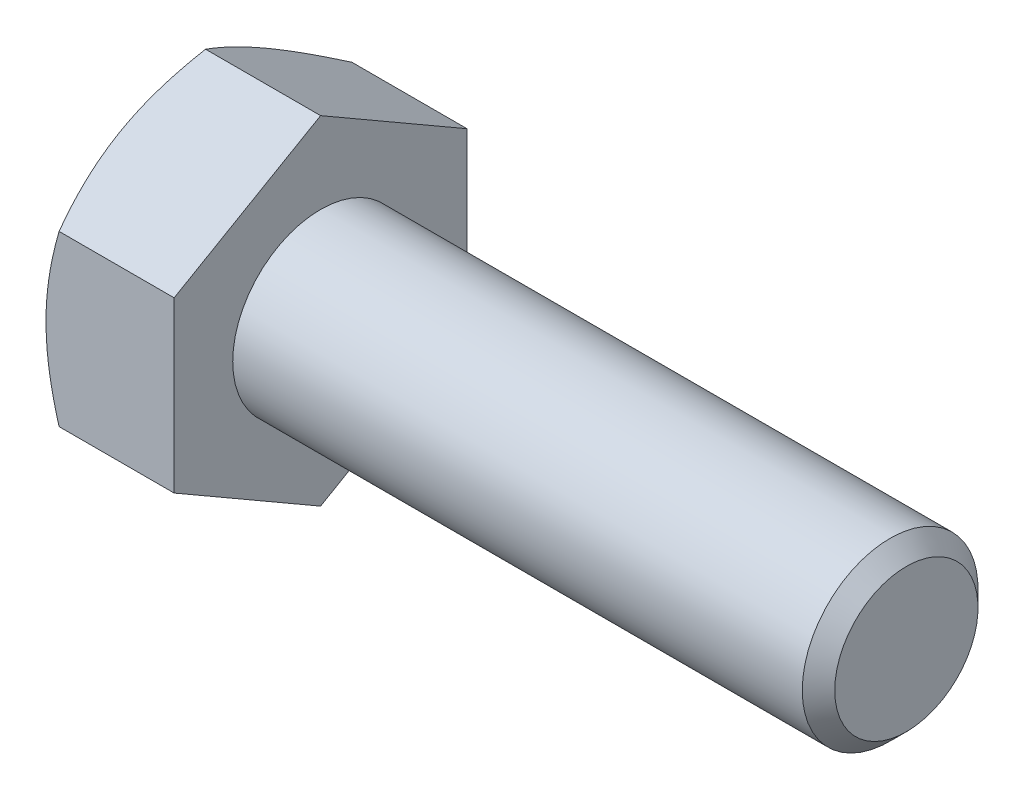
ISO-10303-21;
HEADER;
FILE_DESCRIPTION(('STEP AP214'),'2;1');
FILE_NAME('part.step','',(''),(''),'','','');
FILE_SCHEMA(('AUTOMOTIVE_DESIGN { 1 0 10303 214 1 1 1 1 }'));
ENDSEC;
DATA;
#1=APPLICATION_CONTEXT('core data for automotive mechanical design processes');
#2=APPLICATION_PROTOCOL_DEFINITION('international standard','automotive_design',2000,#1);
#3=PRODUCT_CONTEXT('',#1,'mechanical');
#4=PRODUCT('Part','Part','',(#3));
#5=PRODUCT_RELATED_PRODUCT_CATEGORY('part','',(#4));
#6=PRODUCT_DEFINITION_FORMATION('','',#4);
#7=PRODUCT_DEFINITION_CONTEXT('part definition',#1,'design');
#8=PRODUCT_DEFINITION('design','',#6,#7);
#9=PRODUCT_DEFINITION_SHAPE('','',#8);
#10=(LENGTH_UNIT() NAMED_UNIT(*) SI_UNIT(.MILLI.,.METRE.));
#11=(NAMED_UNIT(*) PLANE_ANGLE_UNIT() SI_UNIT($,.RADIAN.));
#12=(NAMED_UNIT(*) SI_UNIT($,.STERADIAN.) SOLID_ANGLE_UNIT());
#13=UNCERTAINTY_MEASURE_WITH_UNIT(LENGTH_MEASURE(1.E-05),#10,'distance_accuracy_value','');
#14=(GEOMETRIC_REPRESENTATION_CONTEXT(3) GLOBAL_UNCERTAINTY_ASSIGNED_CONTEXT((#13)) GLOBAL_UNIT_ASSIGNED_CONTEXT((#10,
#11,#12)) REPRESENTATION_CONTEXT('',''));
#15=CARTESIAN_POINT('',(0.,0.,0.));
#16=DIRECTION('',(0.,0.,1.));
#17=DIRECTION('',(1.,0.,0.));
#18=AXIS2_PLACEMENT_3D('',#15,#16,#17);
#19=CARTESIAN_POINT('',(4.375,2.88675134594812,-5.));
#20=DIRECTION('',(0.,-0.866025403784438,0.500000000000001));
#21=DIRECTION('',(0.,-0.500000000000001,-0.866025403784438));
#22=AXIS2_PLACEMENT_3D('',#19,#20,#21);
#23=PLANE('',#22);
#24=CARTESIAN_POINT('',(0.44664865605183,5.7736181619501,0.000200000000000224));
#25=CARTESIAN_POINT('',(0.373386567637636,5.64675433465071,-0.219534594525185));
#26=CARTESIAN_POINT('',(0.306751321918093,5.5188054379059,-0.44114858445958));
#27=CARTESIAN_POINT('',(0.190438991010812,5.26069210252318,-0.888213995453512));
#28=CARTESIAN_POINT('',(0.14080304991579,5.13052307794721,-1.11367335959077));
#29=CARTESIAN_POINT('',(0.0635510254186983,4.87177839004641,-1.56183230522351));
#30=CARTESIAN_POINT('',(0.0354203782834892,4.74324302208387,-1.78446209310419));
#31=CARTESIAN_POINT('',(0.0101949219536843,4.54998783160116,-2.11918990184664));
#32=CARTESIAN_POINT('',(0.00461345976948395,4.48552534905128,-2.23084219680506));
#33=CARTESIAN_POINT('',(-0.000797783248529861,4.35654081066911,-2.4542499706738));
#34=CARTESIAN_POINT('',(-0.000627741741796916,4.2920187567385,-2.56600544629031));
#35=CARTESIAN_POINT('',(0.00775363179203597,4.11524635305244,-2.87218423085064));
#36=CARTESIAN_POINT('',(0.0218297718972512,4.00305457769146,-3.06650608596721));
#37=CARTESIAN_POINT('',(0.0664652571094302,3.77941563226457,-3.4538601019977));
#38=CARTESIAN_POINT('',(0.097039860147507,3.66796924828418,-3.64689090137157));
#39=CARTESIAN_POINT('',(0.173468493621162,3.44387972423144,-4.03502534247485));
#40=CARTESIAN_POINT('',(0.219646378878678,3.3312648659868,-4.23007999864173));
#41=CARTESIAN_POINT('',(0.324451794491933,3.1077146415794,-4.61728034535877));
#42=CARTESIAN_POINT('',(0.383054703437373,2.99677641204846,-4.80943099540809));
#43=CARTESIAN_POINT('',(0.446648656051827,2.88663587589429,-5.0002));
#44=B_SPLINE_CURVE_WITH_KNOTS('',3,(#24,#25,#26,#27,#28,#29,#30,#31,#32,#33,#34,#35,#36,#37,#38,
#39,#40,#41,#42,#43),.UNSPECIFIED.,.F.,.F.,(4,2,2,2,2,2,2,2,2,4),(0.,0.792555841363091,
1.58701660053334,2.36181537487281,2.74884076077326,3.13585419177295,3.80962362599679,
4.48401723901189,5.17336882348929,5.86136694793726),.UNSPECIFIED.);
#45=CARTESIAN_POINT('',(0.446581987385204,5.77350269189626,0.));
#46=VERTEX_POINT('',#45);
#47=CARTESIAN_POINT('',(0.,4.33012701892219,-2.50000000000001));
#48=VERTEX_POINT('',#47);
#49=EDGE_CURVE('E52',#46,#48,#44,.T.);
#50=ORIENTED_EDGE('',*,*,#49,.F.);
#51=DIRECTION('',(-1.,0.,0.));
#52=VECTOR('',#51,1.);
#53=CARTESIAN_POINT('',(4.375,5.77350269189626,0.));
#54=LINE('',#53,#52);
#55=CARTESIAN_POINT('',(4.375,5.77350269189626,0.));
#56=VERTEX_POINT('',#55);
#57=EDGE_CURVE('E148',#56,#46,#54,.T.);
#58=ORIENTED_EDGE('',*,*,#57,.F.);
#59=DIRECTION('',(0.,0.500000000000001,0.866025403784438));
#60=VECTOR('',#59,1.);
#61=CARTESIAN_POINT('',(4.375,2.88675134594812,-5.));
#62=LINE('',#61,#60);
#63=CARTESIAN_POINT('',(4.375,2.88675134594812,-5.));
#64=VERTEX_POINT('',#63);
#65=EDGE_CURVE('E233',#64,#56,#62,.T.);
#66=ORIENTED_EDGE('',*,*,#65,.F.);
#67=DIRECTION('',(-1.,0.,0.));
#68=VECTOR('',#67,1.);
#69=CARTESIAN_POINT('',(4.375,2.88675134594812,-5.));
#70=LINE('',#69,#68);
#71=CARTESIAN_POINT('',(0.446581987385201,2.88675134594812,-5.));
#72=VERTEX_POINT('',#71);
#73=EDGE_CURVE('E136',#64,#72,#70,.T.);
#74=ORIENTED_EDGE('',*,*,#73,.T.);
#75=EDGE_CURVE('E130',#48,#72,#44,.T.);
#76=ORIENTED_EDGE('',*,*,#75,.F.);
#77=EDGE_LOOP('',(#50,#58,#66,#74,#76));
#78=FACE_BOUND('',#77,.T.);
#79=ADVANCED_FACE('F36',(#78),#23,.F.);
#80=CARTESIAN_POINT('',(4.375,5.77350269189626,0.));
#81=DIRECTION('',(0.,-0.866025403784438,-0.500000000000001));
#82=DIRECTION('',(0.,0.500000000000001,-0.866025403784438));
#83=AXIS2_PLACEMENT_3D('',#80,#81,#82);
#84=PLANE('',#83);
#85=CARTESIAN_POINT('',(0.446648656051828,2.88663587589429,5.0002));
#86=CARTESIAN_POINT('',(0.373386567637633,3.01349970319368,4.78046540547482));
#87=CARTESIAN_POINT('',(0.306751321918091,3.14144859993849,4.55885141554042));
#88=CARTESIAN_POINT('',(0.19043899101081,3.39956193532121,4.11178600454649));
#89=CARTESIAN_POINT('',(0.140803049915789,3.52973095989717,3.88632664040923));
#90=CARTESIAN_POINT('',(0.0635510254186981,3.78847564779797,3.43816769477649));
#91=CARTESIAN_POINT('',(0.0354203782834895,3.91701101576052,3.21553790689581));
#92=CARTESIAN_POINT('',(0.0101949219536846,4.11026620624322,2.88081009815336));
#93=CARTESIAN_POINT('',(0.00461345976948397,4.17472868879311,2.76915780319494));
#94=CARTESIAN_POINT('',(-0.000797783248529637,4.30371322717528,2.5457500293262));
#95=CARTESIAN_POINT('',(-0.000627741741796285,4.36823528110589,2.43399455370969));
#96=CARTESIAN_POINT('',(0.00775363179203729,4.54500768479194,2.12781576914936));
#97=CARTESIAN_POINT('',(0.0218297718972525,4.65719946015293,1.93349391403279));
#98=CARTESIAN_POINT('',(0.0664652571094319,4.88083840557981,1.5461398980023));
#99=CARTESIAN_POINT('',(0.0970398601475091,4.9922847895602,1.35310909862843));
#100=CARTESIAN_POINT('',(0.173468493621165,5.21637431361295,0.964974657525146));
#101=CARTESIAN_POINT('',(0.219646378878682,5.32898917185759,0.769920001358265));
#102=CARTESIAN_POINT('',(0.324451794491936,5.55253939626499,0.382719654641232));
#103=CARTESIAN_POINT('',(0.383054703437377,5.66347762579592,0.190569004591914));
#104=CARTESIAN_POINT('',(0.446648656051831,5.7736181619501,-0.000200000000000155));
#105=B_SPLINE_CURVE_WITH_KNOTS('',3,(#85,#86,#87,#88,#89,#90,#91,#92,#93,#94,#95,#96,#97,#98,
#99,#100,#101,#102,#103,#104),.UNSPECIFIED.,.F.,.F.,(4,2,2,2,2,2,2,2,2,4),(0.,0.79255584136309,
1.58701660053333,2.3618153748728,2.74884076077325,3.13585419177295,3.80962362599679,
4.48401723901189,5.17336882348929,5.86136694793726),.UNSPECIFIED.);
#106=CARTESIAN_POINT('',(0.446581987385201,2.88675134594813,5.));
#107=VERTEX_POINT('',#106);
#108=CARTESIAN_POINT('',(0.,4.33012701892219,2.5));
#109=VERTEX_POINT('',#108);
#110=EDGE_CURVE('E59',#107,#109,#105,.T.);
#111=ORIENTED_EDGE('',*,*,#110,.F.);
#112=DIRECTION('',(-1.,0.,0.));
#113=VECTOR('',#112,1.);
#114=CARTESIAN_POINT('',(4.375,2.88675134594813,5.));
#115=LINE('',#114,#113);
#116=CARTESIAN_POINT('',(4.375,2.88675134594813,5.));
#117=VERTEX_POINT('',#116);
#118=EDGE_CURVE('E146',#117,#107,#115,.T.);
#119=ORIENTED_EDGE('',*,*,#118,.F.);
#120=DIRECTION('',(0.,-0.500000000000001,0.866025403784438));
#121=VECTOR('',#120,1.);
#122=CARTESIAN_POINT('',(4.375,5.77350269189626,0.));
#123=LINE('',#122,#121);
#124=EDGE_CURVE('E231',#56,#117,#123,.T.);
#125=ORIENTED_EDGE('',*,*,#124,.F.);
#126=ORIENTED_EDGE('',*,*,#57,.T.);
#127=EDGE_CURVE('E163',#109,#46,#105,.T.);
#128=ORIENTED_EDGE('',*,*,#127,.F.);
#129=EDGE_LOOP('',(#111,#119,#125,#126,#128));
#130=FACE_BOUND('',#129,.T.);
#131=ADVANCED_FACE('F169',(#130),#84,.F.);
#132=CARTESIAN_POINT('',(4.375,2.88675134594813,5.));
#133=DIRECTION('',(0.,0.,-1.));
#134=DIRECTION('',(0.,1.,0.));
#135=AXIS2_PLACEMENT_3D('',#132,#133,#134);
#136=PLANE('',#135);
#137=CARTESIAN_POINT('',(2.47533544689295,-7.82661640313889,5.));
#138=CARTESIAN_POINT('',(2.36879683507773,-7.60758613024921,5.));
#139=CARTESIAN_POINT('',(2.26325911833056,-7.3880607136441,5.));
#140=CARTESIAN_POINT('',(2.0547470786595,-6.94775649535433,5.));
#141=CARTESIAN_POINT('',(1.95177314617002,-6.72697750897687,5.));
#142=CARTESIAN_POINT('',(1.74844778545274,-6.28280027125597,5.));
#143=CARTESIAN_POINT('',(1.64811306490868,-6.05939434592712,5.));
#144=CARTESIAN_POINT('',(1.45145486004312,-5.6108304383292,5.));
#145=CARTESIAN_POINT('',(1.35513119080617,-5.38567253739804,5.));
#146=CARTESIAN_POINT('',(1.1644503760596,-4.92576614780202,5.));
#147=CARTESIAN_POINT('',(1.07026351405995,-4.69094667859484,5.));
#148=CARTESIAN_POINT('',(0.888844387350834,-4.21858752735362,5.));
#149=CARTESIAN_POINT('',(0.801612892640656,-3.98104754746316,5.));
#150=CARTESIAN_POINT('',(0.636341071883237,-3.50329086404363,5.));
#151=CARTESIAN_POINT('',(0.558282765149708,-3.26308044250486,5.));
#152=CARTESIAN_POINT('',(0.413813856737663,-2.77921467819531,5.));
#153=CARTESIAN_POINT('',(0.347399663631973,-2.53556042275999,5.));
#154=CARTESIAN_POINT('',(0.22970745053505,-2.04600448312503,5.));
#155=CARTESIAN_POINT('',(0.178346573442477,-1.80012308686183,5.));
#156=CARTESIAN_POINT('',(0.0936230804935141,-1.30522837494365,5.));
#157=CARTESIAN_POINT('',(0.0602585789244913,-1.05621539022477,5.));
#158=CARTESIAN_POINT('',(0.0146229933804838,-0.559584253783063,5.));
#159=CARTESIAN_POINT('',(0.002074985065841,-0.31199219296767,5.));
#160=CARTESIAN_POINT('',(-0.00159747165030465,0.183375584056743,5.));
#161=CARTESIAN_POINT('',(0.00727849448086283,0.431151303726645,5.));
#162=CARTESIAN_POINT('',(0.0397265053205847,0.849622860758231,5.));
#163=CARTESIAN_POINT('',(0.0579847912618802,1.02075746544157,5.));
#164=CARTESIAN_POINT('',(0.103624049996723,1.3618139875752,5.));
#165=CARTESIAN_POINT('',(0.131006199082926,1.53173574577271,5.));
#166=CARTESIAN_POINT('',(0.225403333816324,2.03942834541587,5.));
#167=CARTESIAN_POINT('',(0.304653621104038,2.37495177168564,5.));
#168=CARTESIAN_POINT('',(0.442611792168642,2.87686006020152,5.));
#169=CARTESIAN_POINT('',(0.492453035928119,3.04583048582566,5.));
#170=CARTESIAN_POINT('',(0.597441969480143,3.38213061038659,5.));
#171=CARTESIAN_POINT('',(0.652589698776809,3.5494602970987,5.));
#172=CARTESIAN_POINT('',(0.7672957300064,3.88253122341818,5.));
#173=CARTESIAN_POINT('',(0.826852713137818,4.04827292137365,5.));
#174=CARTESIAN_POINT('',(0.949663499110055,4.37837269604184,5.));
#175=CARTESIAN_POINT('',(1.01291722636638,4.54273080096527,5.));
#176=CARTESIAN_POINT('',(1.18384085306905,4.9746759403977,5.));
#177=CARTESIAN_POINT('',(1.29410564783453,5.24123504256649,5.));
#178=CARTESIAN_POINT('',(1.52085041203993,5.77170603526335,5.));
#179=CARTESIAN_POINT('',(1.63733099805397,6.03561766007929,5.));
#180=CARTESIAN_POINT('',(1.87507624393349,6.56138078778338,5.));
#181=CARTESIAN_POINT('',(1.99634255328238,6.82323154239329,5.));
#182=CARTESIAN_POINT('',(2.24254703861693,7.34518395602016,5.));
#183=CARTESIAN_POINT('',(2.36748508200602,7.60528567778374,5.));
#184=CARTESIAN_POINT('',(2.62044102887898,8.12446478659922,5.));
#185=CARTESIAN_POINT('',(2.74846325062126,8.38354006552433,5.));
#186=CARTESIAN_POINT('',(3.00682668967549,8.90053291127541,5.));
#187=CARTESIAN_POINT('',(3.13716793074432,9.15845046620729,5.));
#188=CARTESIAN_POINT('',(3.53092424591317,9.93067662274979,5.));
#189=CARTESIAN_POINT('',(3.79712405172275,10.4435647238032,5.));
#190=CARTESIAN_POINT('',(4.30724046881171,11.4147548711532,5.));
#191=CARTESIAN_POINT('',(4.55067498762245,11.873311348306,5.));
#192=CARTESIAN_POINT('',(5.04052915785298,12.7888590468283,5.));
#193=CARTESIAN_POINT('',(5.28694897482743,13.2458501795696,5.));
#194=CARTESIAN_POINT('',(5.7812250534644,14.1571829390173,5.));
#195=CARTESIAN_POINT('',(6.02907430461244,14.6115283739736,5.));
#196=CARTESIAN_POINT('',(6.5264818551985,15.5192398746589,5.));
#197=CARTESIAN_POINT('',(6.77604002809906,15.9726060096992,5.));
#198=CARTESIAN_POINT('',(7.02622264559118,16.4256251044156,5.00000000000001));
#199=B_SPLINE_CURVE_WITH_KNOTS('',3,(#137,#138,#139,#140,#141,#142,#143,#144,#145,#146,#147,
#148,#149,#150,#151,#152,#153,#154,#155,#156,#157,#158,#159,#160,#161,#162,#163,#164,#165,#166,
#167,#168,#169,#170,#171,#172,#173,#174,#175,#176,#177,#178,#179,#180,#181,#182,#183,#184,#185,
#186,#187,#188,#189,#190,#191,#192,#193,#194,#195,#196,#197,#198),.UNSPECIFIED.,.F.,.F.,(4,2,2,
2,2,2,2,2,2,2,2,2,2,2,2,2,2,2,2,2,2,2,2,2,2,2,2,2,2,2,4),(0.,0.730708682143099,1.4615279703375,
2.19620403652928,2.930846195478,3.68977491658213,4.44878753915767,5.20628666210827,
5.9635517348485,6.71656679485872,7.46950293642267,8.21233991237299,8.95519126159773,
9.47125991232469,9.98739512288342,11.0201893937443,11.5486465414698,12.0771076235976,
12.6054112774226,13.1337041332035,13.9989833719716,14.8643486020619,15.7300147459346,
16.5956496665091,17.4625765068272,18.3295122333794,20.0630293163822,21.6205191219182,
23.1780956996636,24.7307447704824,26.2832800921358),.UNSPECIFIED.);
#200=CARTESIAN_POINT('',(0.446581987385199,-2.88675134594812,5.));
#201=VERTEX_POINT('',#200);
#202=CARTESIAN_POINT('',(0.,0.,5.));
#203=VERTEX_POINT('',#202);
#204=EDGE_CURVE('E243',#201,#203,#199,.T.);
#205=ORIENTED_EDGE('',*,*,#204,.F.);
#206=DIRECTION('',(-1.,0.,0.));
#207=VECTOR('',#206,1.);
#208=CARTESIAN_POINT('',(4.375,-2.88675134594812,5.));
#209=LINE('',#208,#207);
#210=CARTESIAN_POINT('',(4.375,-2.88675134594812,5.));
#211=VERTEX_POINT('',#210);
#212=EDGE_CURVE('E138',#211,#201,#209,.T.);
#213=ORIENTED_EDGE('',*,*,#212,.F.);
#214=DIRECTION('',(0.,-1.,0.));
#215=VECTOR('',#214,1.);
#216=CARTESIAN_POINT('',(4.375,2.88675134594813,5.));
#217=LINE('',#216,#215);
#218=EDGE_CURVE('E227',#117,#211,#217,.T.);
#219=ORIENTED_EDGE('',*,*,#218,.F.);
#220=ORIENTED_EDGE('',*,*,#118,.T.);
#221=EDGE_CURVE('E185',#203,#107,#199,.T.);
#222=ORIENTED_EDGE('',*,*,#221,.F.);
#223=EDGE_LOOP('',(#205,#213,#219,#220,#222));
#224=FACE_BOUND('',#223,.T.);
#225=ADVANCED_FACE('F249',(#224),#136,.F.);
#226=CARTESIAN_POINT('',(4.375,-5.77350269189626,0.));
#227=DIRECTION('',(0.,0.866025403784438,-0.500000000000002));
#228=DIRECTION('',(0.,0.500000000000002,0.866025403784438));
#229=AXIS2_PLACEMENT_3D('',#226,#227,#228);
#230=PLANE('',#229);
#231=CARTESIAN_POINT('',(0.446648656051831,-5.7736181619501,-0.000200000000000053));
#232=CARTESIAN_POINT('',(0.373386567637637,-5.64675433465071,0.219534594525184));
#233=CARTESIAN_POINT('',(0.306751321918094,-5.5188054379059,0.44114858445958));
#234=CARTESIAN_POINT('',(0.190438991010812,-5.26069210252318,0.888213995453512));
#235=CARTESIAN_POINT('',(0.14080304991579,-5.13052307794721,1.11367335959077));
#236=CARTESIAN_POINT('',(0.0635510254186982,-4.87177839004641,1.56183230522351));
#237=CARTESIAN_POINT('',(0.0354203782834891,-4.74324302208387,1.78446209310419));
#238=CARTESIAN_POINT('',(0.0101949219536837,-4.54998783160116,2.11918990184664));
#239=CARTESIAN_POINT('',(0.00461345976948303,-4.48552534905128,2.23084219680506));
#240=CARTESIAN_POINT('',(-0.000797783248530952,-4.35654081066911,2.4542499706738));
#241=CARTESIAN_POINT('',(-0.000627741741797887,-4.2920187567385,2.56600544629031));
#242=CARTESIAN_POINT('',(0.00775363179203491,-4.11524635305244,2.87218423085064));
#243=CARTESIAN_POINT('',(0.0218297718972496,-4.00305457769146,3.06650608596721));
#244=CARTESIAN_POINT('',(0.0664652571094284,-3.77941563226457,3.4538601019977));
#245=CARTESIAN_POINT('',(0.0970398601475055,-3.66796924828418,3.64689090137157));
#246=CARTESIAN_POINT('',(0.173468493621161,-3.44387972423143,4.03502534247485));
#247=CARTESIAN_POINT('',(0.219646378878677,-3.33126486598679,4.23007999864173));
#248=CARTESIAN_POINT('',(0.324451794491931,-3.1077146415794,4.61728034535877));
#249=CARTESIAN_POINT('',(0.383054703437371,-2.99677641204846,4.80943099540809));
#250=CARTESIAN_POINT('',(0.446648656051825,-2.88663587589428,5.0002));
#251=B_SPLINE_CURVE_WITH_KNOTS('',3,(#231,#232,#233,#234,#235,#236,#237,#238,#239,#240,#241,
#242,#243,#244,#245,#246,#247,#248,#249,#250),.UNSPECIFIED.,.F.,.F.,(4,2,2,2,2,2,2,2,2,4),(0.,
0.792555841363091,1.58701660053333,2.36181537487281,2.74884076077326,3.13585419177295,
3.8096236259968,4.4840172390119,5.17336882348929,5.86136694793726),.UNSPECIFIED.);
#252=CARTESIAN_POINT('',(0.446581987385204,-5.77350269189626,0.));
#253=VERTEX_POINT('',#252);
#254=CARTESIAN_POINT('',(0.,-4.33012701892219,2.50000000000001));
#255=VERTEX_POINT('',#254);
#256=EDGE_CURVE('E171',#253,#255,#251,.T.);
#257=ORIENTED_EDGE('',*,*,#256,.F.);
#258=DIRECTION('',(-1.,0.,0.));
#259=VECTOR('',#258,1.);
#260=CARTESIAN_POINT('',(4.375,-5.77350269189626,0.));
#261=LINE('',#260,#259);
#262=CARTESIAN_POINT('',(4.375,-5.77350269189626,0.));
#263=VERTEX_POINT('',#262);
#264=EDGE_CURVE('E135',#263,#253,#261,.T.);
#265=ORIENTED_EDGE('',*,*,#264,.F.);
#266=DIRECTION('',(0.,-0.500000000000002,-0.866025403784437));
#267=VECTOR('',#266,1.);
#268=CARTESIAN_POINT('',(4.375,-5.77350269189626,0.));
#269=LINE('',#268,#267);
#270=EDGE_CURVE('E225',#211,#263,#269,.T.);
#271=ORIENTED_EDGE('',*,*,#270,.F.);
#272=ORIENTED_EDGE('',*,*,#212,.T.);
#273=EDGE_CURVE('E173',#255,#201,#251,.T.);
#274=ORIENTED_EDGE('',*,*,#273,.F.);
#275=EDGE_LOOP('',(#257,#265,#271,#272,#274));
#276=FACE_BOUND('',#275,.T.);
#277=ADVANCED_FACE('F221',(#276),#230,.F.);
#278=CARTESIAN_POINT('',(4.375,-2.88675134594813,-5.));
#279=DIRECTION('',(0.,0.866025403784439,0.5));
#280=DIRECTION('',(0.,-0.5,0.866025403784439));
#281=AXIS2_PLACEMENT_3D('',#278,#279,#280);
#282=PLANE('',#281);
#283=CARTESIAN_POINT('',(0.446648656051831,-2.8866358758943,-5.0002));
#284=CARTESIAN_POINT('',(0.373386567637637,-3.01349970319368,-4.78046540547482));
#285=CARTESIAN_POINT('',(0.306751321918094,-3.1414485999385,-4.55885141554042));
#286=CARTESIAN_POINT('',(0.190438991010812,-3.39956193532121,-4.11178600454649));
#287=CARTESIAN_POINT('',(0.140803049915791,-3.52973095989718,-3.88632664040923));
#288=CARTESIAN_POINT('',(0.0635510254186999,-3.78847564779798,-3.43816769477649));
#289=CARTESIAN_POINT('',(0.0354203782834916,-3.91701101576052,-3.21553790689581));
#290=CARTESIAN_POINT('',(0.0101949219536869,-4.11026620624323,-2.88081009815336));
#291=CARTESIAN_POINT('',(0.00461345976948639,-4.17472868879311,-2.76915780319494));
#292=CARTESIAN_POINT('',(-0.000797783248527292,-4.30371322717528,-2.5457500293262));
#293=CARTESIAN_POINT('',(-0.000627741741794088,-4.36823528110589,-2.43399455370968));
#294=CARTESIAN_POINT('',(0.00775363179203927,-4.54500768479195,-2.12781576914936));
#295=CARTESIAN_POINT('',(0.0218297718972545,-4.65719946015293,-1.93349391403278));
#296=CARTESIAN_POINT('',(0.066465257109434,-4.88083840557982,-1.54613989800229));
#297=CARTESIAN_POINT('',(0.0970398601475113,-4.99228478956021,-1.35310909862843));
#298=CARTESIAN_POINT('',(0.173468493621167,-5.21637431361295,-0.964974657525145));
#299=CARTESIAN_POINT('',(0.219646378878683,-5.32898917185759,-0.769920001358264));
#300=CARTESIAN_POINT('',(0.324451794491937,-5.55253939626499,-0.382719654641232));
#301=CARTESIAN_POINT('',(0.383054703437377,-5.66347762579592,-0.190569004591914));
#302=CARTESIAN_POINT('',(0.446648656051831,-5.7736181619501,0.000199999999999427));
#303=B_SPLINE_CURVE_WITH_KNOTS('',3,(#283,#284,#285,#286,#287,#288,#289,#290,#291,#292,#293,
#294,#295,#296,#297,#298,#299,#300,#301,#302),.UNSPECIFIED.,.F.,.F.,(4,2,2,2,2,2,2,2,2,4),(0.,
0.792555841363091,1.58701660053334,2.36181537487281,2.74884076077326,3.13585419177295,
3.80962362599679,4.48401723901189,5.17336882348929,5.86136694793725),.UNSPECIFIED.);
#304=CARTESIAN_POINT('',(0.446581987384949,-2.88675134594852,-5.));
#305=VERTEX_POINT('',#304);
#306=CARTESIAN_POINT('',(0.,-4.33012701892219,-2.5));
#307=VERTEX_POINT('',#306);
#308=EDGE_CURVE('E112',#305,#307,#303,.T.);
#309=ORIENTED_EDGE('',*,*,#308,.F.);
#310=DIRECTION('',(-1.,0.,0.));
#311=VECTOR('',#310,1.);
#312=CARTESIAN_POINT('',(4.375,-2.88675134594813,-5.));
#313=LINE('',#312,#311);
#314=CARTESIAN_POINT('',(4.375,-2.88675134594813,-5.));
#315=VERTEX_POINT('',#314);
#316=EDGE_CURVE('E126',#315,#305,#313,.T.);
#317=ORIENTED_EDGE('',*,*,#316,.F.);
#318=DIRECTION('',(0.,0.5,-0.866025403784439));
#319=VECTOR('',#318,1.);
#320=CARTESIAN_POINT('',(4.375,-2.88675134594813,-5.));
#321=LINE('',#320,#319);
#322=EDGE_CURVE('E223',#263,#315,#321,.T.);
#323=ORIENTED_EDGE('',*,*,#322,.F.);
#324=ORIENTED_EDGE('',*,*,#264,.T.);
#325=EDGE_CURVE('E129',#307,#253,#303,.T.);
#326=ORIENTED_EDGE('',*,*,#325,.F.);
#327=EDGE_LOOP('',(#309,#317,#323,#324,#326));
#328=FACE_BOUND('',#327,.T.);
#329=ADVANCED_FACE('F124',(#328),#282,.F.);
#330=CARTESIAN_POINT('',(4.375,2.88675134594812,-5.));
#331=DIRECTION('',(0.,0.,1.));
#332=DIRECTION('',(0.,-1.,0.));
#333=AXIS2_PLACEMENT_3D('',#330,#331,#332);
#334=PLANE('',#333);
#335=CARTESIAN_POINT('',(2.47533544773018,-7.82661640485967,-5.));
#336=CARTESIAN_POINT('',(2.36879683588001,-7.60758613191209,-5.));
#337=CARTESIAN_POINT('',(2.2632591190979,-7.38806071524903,-5.));
#338=CARTESIAN_POINT('',(2.05474707935716,-6.9477564968432,-5.));
#339=CARTESIAN_POINT('',(1.95177314683291,-6.72697751040762,-5.));
#340=CARTESIAN_POINT('',(1.74844778604609,-6.28280027256958,-5.));
#341=CARTESIAN_POINT('',(1.64811306546725,-6.05939434718172,-5.));
#342=CARTESIAN_POINT('',(1.4514548605327,-5.61083043946536,-5.));
#343=CARTESIAN_POINT('',(1.35513119126155,-5.38567253847479,-5.));
#344=CARTESIAN_POINT('',(1.16445037644562,-4.92576614875538,-5.));
#345=CARTESIAN_POINT('',(1.07026351441089,-4.69094667948418,-5.));
#346=CARTESIAN_POINT('',(0.888844387633474,-4.21858752811391,-5.));
#347=CARTESIAN_POINT('',(0.801612892890086,-3.98104754815841,-5.));
#348=CARTESIAN_POINT('',(0.636341072069424,-3.50329086460758,-5.));
#349=CARTESIAN_POINT('',(0.558282765305854,-3.26308044300257,-5.));
#350=CARTESIAN_POINT('',(0.41381385683863,-2.77921467855872,-5.));
#351=CARTESIAN_POINT('',(0.347399663707799,-2.53556042305535,-5.));
#352=CARTESIAN_POINT('',(0.229707450560148,-2.04600448324933,-5.));
#353=CARTESIAN_POINT('',(0.178346573443938,-1.80012308688265,-5.));
#354=CARTESIAN_POINT('',(0.0936230804633186,-1.305228374755,-5.));
#355=CARTESIAN_POINT('',(0.0602585788862656,-1.05621538993014,-5.));
#356=CARTESIAN_POINT('',(0.014622993345085,-0.559584253278234,-5.));
#357=CARTESIAN_POINT('',(0.00207498504095115,-0.311992192358638,-5.));
#358=CARTESIAN_POINT('',(-0.00159747163599418,0.183375584872586,-5.));
#359=CARTESIAN_POINT('',(0.00727849452386965,0.431151304645097,-5.));
#360=CARTESIAN_POINT('',(0.0397265054214774,0.849622861805588,-5.));
#361=CARTESIAN_POINT('',(0.0579847913857288,1.02075746651638,-5.));
#362=CARTESIAN_POINT('',(0.103624050167705,1.3618139887037,-5.));
#363=CARTESIAN_POINT('',(0.131006199278085,1.53173574692745,-5.));
#364=CARTESIAN_POINT('',(0.225403334084525,2.03942834664787,-5.));
#365=CARTESIAN_POINT('',(0.304653621421581,2.37495177296713,-5.));
#366=CARTESIAN_POINT('',(0.442611792558999,2.87686006155704,-5.));
#367=CARTESIAN_POINT('',(0.492453036342916,3.04583048720638,-5.));
#368=CARTESIAN_POINT('',(0.597441969943076,3.38213061181744,-5.));
#369=CARTESIAN_POINT('',(0.652589699263437,3.54946029855447,-5.));
#370=CARTESIAN_POINT('',(0.767295730539577,3.88253122492361,-5.));
#371=CARTESIAN_POINT('',(0.826852713693845,4.04827292290382,-5.));
#372=CARTESIAN_POINT('',(0.949663499710993,4.37837269762149,-5.));
#373=CARTESIAN_POINT('',(1.01291722698937,4.54273080256966,-5.));
#374=CARTESIAN_POINT('',(1.18384085372923,4.97467594201676,-5.));
#375=CARTESIAN_POINT('',(1.29410564850765,5.24123504417613,-5.));
#376=CARTESIAN_POINT('',(1.5208504127353,5.77170603685536,-5.));
#377=CARTESIAN_POINT('',(1.63733099875865,6.03561766166309,-5.));
#378=CARTESIAN_POINT('',(1.87507624465413,6.56138078935161,-5.));
#379=CARTESIAN_POINT('',(1.99634255400967,6.82323154395418,-5.));
#380=CARTESIAN_POINT('',(2.24254703935561,7.34518395756714,-5.));
#381=CARTESIAN_POINT('',(2.36748508274945,7.60528567932417,-5.));
#382=CARTESIAN_POINT('',(2.62044102963033,8.12446478812675,-5.));
#383=CARTESIAN_POINT('',(2.74846325137578,8.38354006704552,-5.));
#384=CARTESIAN_POINT('',(3.00682669043527,8.9005329127844,-5.));
#385=CARTESIAN_POINT('',(3.1371679315062,9.15845046771043,-5.));
#386=CARTESIAN_POINT('',(3.53092424668022,9.93067662423604,-5.));
#387=CARTESIAN_POINT('',(3.79712405249168,10.443564725279,-5.));
#388=CARTESIAN_POINT('',(4.30724046958687,11.4147548726184,-5.));
#389=CARTESIAN_POINT('',(4.55067498840223,11.8733113497711,-5.));
#390=CARTESIAN_POINT('',(5.04052915864104,12.7888590482935,-5.));
#391=CARTESIAN_POINT('',(5.28694897561916,13.2458501810351,-5.));
#392=CARTESIAN_POINT('',(5.78122505426358,14.1571829404851,-5.));
#393=CARTESIAN_POINT('',(6.02907430541544,14.6115283754434,-5.));
#394=CARTESIAN_POINT('',(6.52648185600867,15.519239876133,-5.));
#395=CARTESIAN_POINT('',(6.77604002891261,15.9726060111756,-5.));
#396=CARTESIAN_POINT('',(7.02622264640795,16.4256251058943,-5.));
#397=B_SPLINE_CURVE_WITH_KNOTS('',3,(#335,#336,#337,#338,#339,#340,#341,#342,#343,#344,#345,
#346,#347,#348,#349,#350,#351,#352,#353,#354,#355,#356,#357,#358,#359,#360,#361,#362,#363,#364,
#365,#366,#367,#368,#369,#370,#371,#372,#373,#374,#375,#376,#377,#378,#379,#380,#381,#382,#383,
#384,#385,#386,#387,#388,#389,#390,#391,#392,#393,#394,#395,#396),.UNSPECIFIED.,.F.,.F.,(4,2,2,
2,2,2,2,2,2,2,2,2,2,2,2,2,2,2,2,2,2,2,2,2,2,2,2,2,2,2,4),(0.,0.730708682345173,1.46152797074169,
2.19620403713772,2.93084619629068,3.6897749176122,4.44878754040521,5.20628666357256,
5.96355173652936,6.7165667968573,7.46950293873851,8.21233991499825,8.95519126453256,
9.47125991534871,9.98739512599665,11.0201893970363,11.5486465448551,12.0771076270762,
12.6054112809942,13.1337041368682,13.9989833756252,14.8643486057043,15.7300147495654,
16.5956496701284,17.4625765104336,18.329512236973,20.0630293199505,21.6205191254926,
23.178095703244,24.7307447740735,26.2832800957379),.UNSPECIFIED.);
#398=CARTESIAN_POINT('',(0.,0.,-5.));
#399=VERTEX_POINT('',#398);
#400=EDGE_CURVE('E118',#72,#399,#397,.F.);
#401=ORIENTED_EDGE('',*,*,#400,.F.);
#402=ORIENTED_EDGE('',*,*,#73,.F.);
#403=DIRECTION('',(0.,1.,0.));
#404=VECTOR('',#403,1.);
#405=CARTESIAN_POINT('',(4.375,2.88675134594812,-5.));
#406=LINE('',#405,#404);
#407=EDGE_CURVE('E134',#315,#64,#406,.T.);
#408=ORIENTED_EDGE('',*,*,#407,.F.);
#409=ORIENTED_EDGE('',*,*,#316,.T.);
#410=EDGE_CURVE('E109',#399,#305,#397,.F.);
#411=ORIENTED_EDGE('',*,*,#410,.F.);
#412=EDGE_LOOP('',(#401,#402,#408,#409,#411));
#413=FACE_BOUND('',#412,.T.);
#414=ADVANCED_FACE('F132',(#413),#334,.F.);
#415=CARTESIAN_POINT('',(4.375,5.77350269189626,0.));
#416=DIRECTION('',(1.,0.,0.));
#417=DIRECTION('',(0.,0.,-1.));
#418=AXIS2_PLACEMENT_3D('',#415,#416,#417);
#419=PLANE('',#418);
#420=CARTESIAN_POINT('',(4.375,0.,0.));
#421=DIRECTION('',(1.,0.,0.));
#422=DIRECTION('',(0.,0.,-1.));
#423=AXIS2_PLACEMENT_3D('',#420,#421,#422);
#424=CIRCLE('',#423,3.);
#425=CARTESIAN_POINT('',(4.375,0.,-3.));
#426=VERTEX_POINT('',#425);
#427=EDGE_CURVE('E236',#426,#426,#424,.F.);
#428=ORIENTED_EDGE('',*,*,#427,.T.);
#429=EDGE_LOOP('',(#428));
#430=FACE_BOUND('',#429,.T.);
#431=ORIENTED_EDGE('',*,*,#65,.T.);
#432=ORIENTED_EDGE('',*,*,#124,.T.);
#433=ORIENTED_EDGE('',*,*,#218,.T.);
#434=ORIENTED_EDGE('',*,*,#270,.T.);
#435=ORIENTED_EDGE('',*,*,#322,.T.);
#436=ORIENTED_EDGE('',*,*,#407,.T.);
#437=EDGE_LOOP('',(#431,#432,#433,#434,#435,#436));
#438=FACE_BOUND('',#437,.T.);
#439=ADVANCED_FACE('F251',(#430,#438),#419,.T.);
#440=CARTESIAN_POINT('',(0.,0.,0.));
#441=DIRECTION('',(-1.,0.,0.));
#442=DIRECTION('',(0.,0.,1.));
#443=AXIS2_PLACEMENT_3D('',#440,#441,#442);
#444=CYLINDRICAL_SURFACE('',#443,3.);
#445=ORIENTED_EDGE('',*,*,#427,.F.);
#446=EDGE_LOOP('',(#445));
#447=FACE_BOUND('',#446,.T.);
#448=CARTESIAN_POINT('',(23.8205,0.,0.));
#449=DIRECTION('',(-1.,0.,0.));
#450=DIRECTION('',(0.,0.,1.));
#451=AXIS2_PLACEMENT_3D('',#448,#449,#450);
#452=CIRCLE('',#451,3.);
#453=CARTESIAN_POINT('',(23.8205,0.,3.));
#454=VERTEX_POINT('',#453);
#455=EDGE_CURVE('E239',#454,#454,#452,.T.);
#456=ORIENTED_EDGE('',*,*,#455,.T.);
#457=EDGE_LOOP('',(#456));
#458=FACE_BOUND('',#457,.T.);
#459=ADVANCED_FACE('F282',(#447,#458),#444,.T.);
#460=CARTESIAN_POINT('',(24.375,0.,0.));
#461=DIRECTION('',(-1.,0.,0.));
#462=DIRECTION('',(0.,0.,1.));
#463=AXIS2_PLACEMENT_3D('',#460,#461,#462);
#464=CONICAL_SURFACE('',#463,2.4455,0.785398163397442);
#465=ORIENTED_EDGE('',*,*,#455,.F.);
#466=EDGE_LOOP('',(#465));
#467=FACE_BOUND('',#466,.T.);
#468=CARTESIAN_POINT('',(24.375,0.,0.));
#469=DIRECTION('',(-1.,0.,0.));
#470=DIRECTION('',(0.,0.,1.));
#471=AXIS2_PLACEMENT_3D('',#468,#469,#470);
#472=CIRCLE('',#471,2.4455);
#473=CARTESIAN_POINT('',(24.375,0.,2.4455));
#474=VERTEX_POINT('',#473);
#475=EDGE_CURVE('E241',#474,#474,#472,.T.);
#476=ORIENTED_EDGE('',*,*,#475,.T.);
#477=EDGE_LOOP('',(#476));
#478=FACE_BOUND('',#477,.T.);
#479=ADVANCED_FACE('F285',(#467,#478),#464,.T.);
#480=CARTESIAN_POINT('',(24.375,0.,0.));
#481=DIRECTION('',(-1.,0.,0.));
#482=DIRECTION('',(0.,0.,1.));
#483=AXIS2_PLACEMENT_3D('',#480,#481,#482);
#484=PLANE('',#483);
#485=ORIENTED_EDGE('',*,*,#475,.F.);
#486=EDGE_LOOP('',(#485));
#487=FACE_BOUND('',#486,.T.);
#488=ADVANCED_FACE('F198',(#487),#484,.F.);
#489=CARTESIAN_POINT('',(0.,0.,0.));
#490=DIRECTION('',(1.,0.,0.));
#491=DIRECTION('',(0.,0.,-1.));
#492=AXIS2_PLACEMENT_3D('',#489,#490,#491);
#493=CONICAL_SURFACE('',#492,5.,1.0471975511966);
#494=ORIENTED_EDGE('',*,*,#308,.T.);
#495=CARTESIAN_POINT('',(0.,0.,0.));
#496=DIRECTION('',(1.,0.,0.));
#497=DIRECTION('',(0.,0.,-1.));
#498=AXIS2_PLACEMENT_3D('',#495,#496,#497);
#499=CIRCLE('',#498,5.);
#500=EDGE_CURVE('E40',#307,#399,#499,.T.);
#501=ORIENTED_EDGE('',*,*,#500,.T.);
#502=ORIENTED_EDGE('',*,*,#410,.T.);
#503=EDGE_LOOP('',(#494,#501,#502));
#504=FACE_BOUND('',#503,.T.);
#505=ADVANCED_FACE('F111',(#504),#493,.T.);
#506=ORIENTED_EDGE('',*,*,#256,.T.);
#507=EDGE_CURVE('E153',#255,#307,#499,.T.);
#508=ORIENTED_EDGE('',*,*,#507,.T.);
#509=ORIENTED_EDGE('',*,*,#325,.T.);
#510=EDGE_LOOP('',(#506,#508,#509));
#511=FACE_BOUND('',#510,.T.);
#512=ADVANCED_FACE('F197',(#511),#493,.T.);
#513=ORIENTED_EDGE('',*,*,#204,.T.);
#514=EDGE_CURVE('E154',#203,#255,#499,.T.);
#515=ORIENTED_EDGE('',*,*,#514,.T.);
#516=ORIENTED_EDGE('',*,*,#273,.T.);
#517=EDGE_LOOP('',(#513,#515,#516));
#518=FACE_BOUND('',#517,.T.);
#519=ADVANCED_FACE('F192',(#518),#493,.T.);
#520=ORIENTED_EDGE('',*,*,#221,.T.);
#521=ORIENTED_EDGE('',*,*,#110,.T.);
#522=CARTESIAN_POINT('',(0.,0.,0.));
#523=DIRECTION('',(-1.,0.,0.));
#524=DIRECTION('',(0.,0.,1.));
#525=AXIS2_PLACEMENT_3D('',#522,#523,#524);
#526=CIRCLE('',#525,5.);
#527=EDGE_CURVE('E119',#203,#109,#526,.T.);
#528=ORIENTED_EDGE('',*,*,#527,.F.);
#529=EDGE_LOOP('',(#520,#521,#528));
#530=FACE_BOUND('',#529,.T.);
#531=ADVANCED_FACE('F196',(#530),#493,.T.);
#532=ORIENTED_EDGE('',*,*,#127,.T.);
#533=ORIENTED_EDGE('',*,*,#49,.T.);
#534=EDGE_CURVE('E45',#48,#109,#499,.T.);
#535=ORIENTED_EDGE('',*,*,#534,.T.);
#536=EDGE_LOOP('',(#532,#533,#535));
#537=FACE_BOUND('',#536,.T.);
#538=ADVANCED_FACE('F162',(#537),#493,.T.);
#539=ORIENTED_EDGE('',*,*,#75,.T.);
#540=ORIENTED_EDGE('',*,*,#400,.T.);
#541=EDGE_CURVE('E11',#399,#48,#499,.T.);
#542=ORIENTED_EDGE('',*,*,#541,.T.);
#543=EDGE_LOOP('',(#539,#540,#542));
#544=FACE_BOUND('',#543,.T.);
#545=ADVANCED_FACE('F254',(#544),#493,.T.);
#546=CARTESIAN_POINT('',(0.,5.77350269189626,0.));
#547=DIRECTION('',(1.,0.,0.));
#548=DIRECTION('',(0.,0.,-1.));
#549=AXIS2_PLACEMENT_3D('',#546,#547,#548);
#550=PLANE('',#549);
#551=ORIENTED_EDGE('',*,*,#541,.F.);
#552=ORIENTED_EDGE('',*,*,#500,.F.);
#553=ORIENTED_EDGE('',*,*,#507,.F.);
#554=ORIENTED_EDGE('',*,*,#514,.F.);
#555=ORIENTED_EDGE('',*,*,#527,.T.);
#556=ORIENTED_EDGE('',*,*,#534,.F.);
#557=EDGE_LOOP('',(#551,#552,#553,#554,#555,#556));
#558=FACE_BOUND('',#557,.T.);
#559=ADVANCED_FACE('F166',(#558),#550,.F.);
#560=CLOSED_SHELL('',(#79,#131,#225,#277,#329,#414,#439,#459,#479,#488,#505,#512,#519,#531,#538,
#545,#559));
#561=MANIFOLD_SOLID_BREP('B2',#560);
#562=ADVANCED_BREP_SHAPE_REPRESENTATION('',(#18,#561),#14);
#563=SHAPE_DEFINITION_REPRESENTATION(#9,#562);
ENDSEC;
END-ISO-10303-21;
